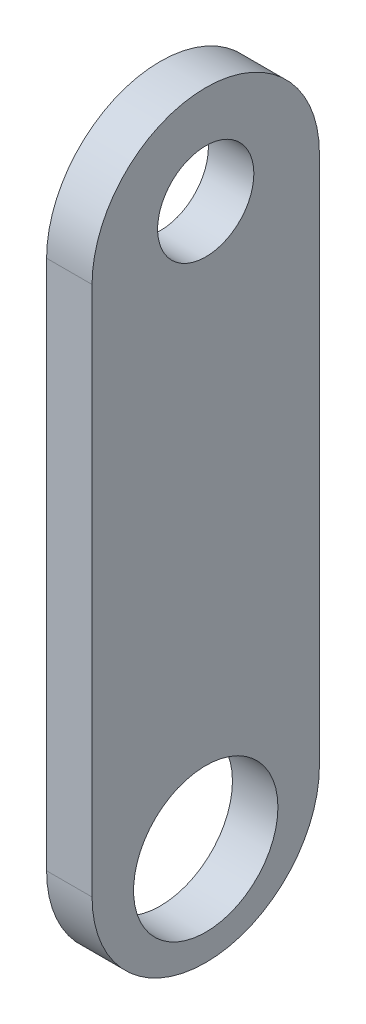
ISO-10303-21;
HEADER;
FILE_DESCRIPTION(('STEP AP214'),'2;1');
FILE_NAME('part.step','',(''),(''),'','','');
FILE_SCHEMA(('AUTOMOTIVE_DESIGN { 1 0 10303 214 1 1 1 1 }'));
ENDSEC;
DATA;
#1=APPLICATION_CONTEXT('core data for automotive mechanical design processes');
#2=APPLICATION_PROTOCOL_DEFINITION('international standard','automotive_design',2000,#1);
#3=PRODUCT_CONTEXT('',#1,'mechanical');
#4=PRODUCT('Part','Part','',(#3));
#5=PRODUCT_RELATED_PRODUCT_CATEGORY('part','',(#4));
#6=PRODUCT_DEFINITION_FORMATION('','',#4);
#7=PRODUCT_DEFINITION_CONTEXT('part definition',#1,'design');
#8=PRODUCT_DEFINITION('design','',#6,#7);
#9=PRODUCT_DEFINITION_SHAPE('','',#8);
#10=(LENGTH_UNIT() NAMED_UNIT(*) SI_UNIT(.MILLI.,.METRE.));
#11=(NAMED_UNIT(*) PLANE_ANGLE_UNIT() SI_UNIT($,.RADIAN.));
#12=(NAMED_UNIT(*) SI_UNIT($,.STERADIAN.) SOLID_ANGLE_UNIT());
#13=UNCERTAINTY_MEASURE_WITH_UNIT(LENGTH_MEASURE(1.E-05),#10,'distance_accuracy_value','');
#14=(GEOMETRIC_REPRESENTATION_CONTEXT(3) GLOBAL_UNCERTAINTY_ASSIGNED_CONTEXT((#13)) GLOBAL_UNIT_ASSIGNED_CONTEXT((#10,
#11,#12)) REPRESENTATION_CONTEXT('',''));
#15=CARTESIAN_POINT('',(0.,0.,0.));
#16=DIRECTION('',(0.,0.,1.));
#17=DIRECTION('',(1.,0.,0.));
#18=AXIS2_PLACEMENT_3D('',#15,#16,#17);
#19=CARTESIAN_POINT('',(3.,-17.5,0.));
#20=DIRECTION('',(-1.,0.,0.));
#21=DIRECTION('',(0.,0.,1.));
#22=AXIS2_PLACEMENT_3D('',#19,#20,#21);
#23=CYLINDRICAL_SURFACE('',#22,7.5);
#24=DIRECTION('',(-1.,0.,0.));
#25=VECTOR('',#24,1.);
#26=CARTESIAN_POINT('',(3.,-17.5,-7.5));
#27=LINE('',#26,#25);
#28=CARTESIAN_POINT('',(3.,-17.5,-7.5));
#29=VERTEX_POINT('',#28);
#30=CARTESIAN_POINT('',(0.,-17.5,-7.5));
#31=VERTEX_POINT('',#30);
#32=EDGE_CURVE('E98',#29,#31,#27,.T.);
#33=ORIENTED_EDGE('',*,*,#32,.F.);
#34=CARTESIAN_POINT('',(3.,-17.5,0.));
#35=DIRECTION('',(-1.,0.,0.));
#36=DIRECTION('',(0.,0.,1.));
#37=AXIS2_PLACEMENT_3D('',#34,#35,#36);
#38=CIRCLE('',#37,7.5);
#39=CARTESIAN_POINT('',(3.,-17.5,7.5));
#40=VERTEX_POINT('',#39);
#41=EDGE_CURVE('E50',#40,#29,#38,.F.);
#42=ORIENTED_EDGE('',*,*,#41,.F.);
#43=DIRECTION('',(1.,0.,0.));
#44=VECTOR('',#43,1.);
#45=CARTESIAN_POINT('',(3.,-17.5,7.5));
#46=LINE('',#45,#44);
#47=CARTESIAN_POINT('',(0.,-17.5,7.5));
#48=VERTEX_POINT('',#47);
#49=EDGE_CURVE('E120',#48,#40,#46,.T.);
#50=ORIENTED_EDGE('',*,*,#49,.F.);
#51=CARTESIAN_POINT('',(0.,-17.5,0.));
#52=DIRECTION('',(-1.,0.,0.));
#53=DIRECTION('',(0.,0.,1.));
#54=AXIS2_PLACEMENT_3D('',#51,#52,#53);
#55=CIRCLE('',#54,7.5);
#56=EDGE_CURVE('E11',#31,#48,#55,.T.);
#57=ORIENTED_EDGE('',*,*,#56,.F.);
#58=EDGE_LOOP('',(#33,#42,#50,#57));
#59=FACE_BOUND('',#58,.T.);
#60=ADVANCED_FACE('F41',(#59),#23,.T.);
#61=CARTESIAN_POINT('',(3.,17.5,0.));
#62=DIRECTION('',(-1.,0.,0.));
#63=DIRECTION('',(0.,0.,1.));
#64=AXIS2_PLACEMENT_3D('',#61,#62,#63);
#65=CYLINDRICAL_SURFACE('',#64,7.5);
#66=DIRECTION('',(-1.,0.,0.));
#67=VECTOR('',#66,1.);
#68=CARTESIAN_POINT('',(3.,17.5,7.5));
#69=LINE('',#68,#67);
#70=CARTESIAN_POINT('',(3.,17.5,7.5));
#71=VERTEX_POINT('',#70);
#72=CARTESIAN_POINT('',(0.,17.5,7.5));
#73=VERTEX_POINT('',#72);
#74=EDGE_CURVE('E94',#71,#73,#69,.T.);
#75=ORIENTED_EDGE('',*,*,#74,.F.);
#76=CARTESIAN_POINT('',(3.,17.5,0.));
#77=DIRECTION('',(-1.,0.,0.));
#78=DIRECTION('',(0.,0.,1.));
#79=AXIS2_PLACEMENT_3D('',#76,#77,#78);
#80=CIRCLE('',#79,7.5);
#81=CARTESIAN_POINT('',(3.,17.5,-7.5));
#82=VERTEX_POINT('',#81);
#83=EDGE_CURVE('E99',#82,#71,#80,.F.);
#84=ORIENTED_EDGE('',*,*,#83,.F.);
#85=DIRECTION('',(1.,0.,0.));
#86=VECTOR('',#85,1.);
#87=CARTESIAN_POINT('',(3.,17.5,-7.5));
#88=LINE('',#87,#86);
#89=CARTESIAN_POINT('',(0.,17.5,-7.5));
#90=VERTEX_POINT('',#89);
#91=EDGE_CURVE('E96',#90,#82,#88,.T.);
#92=ORIENTED_EDGE('',*,*,#91,.F.);
#93=CARTESIAN_POINT('',(0.,17.5,0.));
#94=DIRECTION('',(-1.,0.,0.));
#95=DIRECTION('',(0.,0.,1.));
#96=AXIS2_PLACEMENT_3D('',#93,#94,#95);
#97=CIRCLE('',#96,7.5);
#98=EDGE_CURVE('E82',#73,#90,#97,.T.);
#99=ORIENTED_EDGE('',*,*,#98,.F.);
#100=EDGE_LOOP('',(#75,#84,#92,#99));
#101=FACE_BOUND('',#100,.T.);
#102=ADVANCED_FACE('F92',(#101),#65,.T.);
#103=CARTESIAN_POINT('',(3.,-25.,7.5));
#104=DIRECTION('',(0.,0.,1.));
#105=DIRECTION('',(1.,0.,0.));
#106=AXIS2_PLACEMENT_3D('',#103,#104,#105);
#107=PLANE('',#106);
#108=DIRECTION('',(0.,1.,0.));
#109=VECTOR('',#108,1.);
#110=CARTESIAN_POINT('',(0.,-25.,7.5));
#111=LINE('',#110,#109);
#112=EDGE_CURVE('E79',#48,#73,#111,.T.);
#113=ORIENTED_EDGE('',*,*,#112,.F.);
#114=ORIENTED_EDGE('',*,*,#49,.T.);
#115=DIRECTION('',(0.,1.,0.));
#116=VECTOR('',#115,1.);
#117=CARTESIAN_POINT('',(3.,-25.,7.5));
#118=LINE('',#117,#116);
#119=EDGE_CURVE('E103',#40,#71,#118,.T.);
#120=ORIENTED_EDGE('',*,*,#119,.T.);
#121=ORIENTED_EDGE('',*,*,#74,.T.);
#122=EDGE_LOOP('',(#113,#114,#120,#121));
#123=FACE_BOUND('',#122,.T.);
#124=ADVANCED_FACE('F101',(#123),#107,.T.);
#125=CARTESIAN_POINT('',(3.,-25.,-7.5));
#126=DIRECTION('',(0.,0.,1.));
#127=DIRECTION('',(1.,0.,0.));
#128=AXIS2_PLACEMENT_3D('',#125,#126,#127);
#129=PLANE('',#128);
#130=DIRECTION('',(0.,1.,0.));
#131=VECTOR('',#130,1.);
#132=CARTESIAN_POINT('',(3.,-25.,-7.5));
#133=LINE('',#132,#131);
#134=EDGE_CURVE('E106',#29,#82,#133,.T.);
#135=ORIENTED_EDGE('',*,*,#134,.F.);
#136=ORIENTED_EDGE('',*,*,#32,.T.);
#137=DIRECTION('',(0.,1.,0.));
#138=VECTOR('',#137,1.);
#139=CARTESIAN_POINT('',(0.,-25.,-7.5));
#140=LINE('',#139,#138);
#141=EDGE_CURVE('E87',#31,#90,#140,.T.);
#142=ORIENTED_EDGE('',*,*,#141,.T.);
#143=ORIENTED_EDGE('',*,*,#91,.T.);
#144=EDGE_LOOP('',(#135,#136,#142,#143));
#145=FACE_BOUND('',#144,.T.);
#146=ADVANCED_FACE('F127',(#145),#129,.F.);
#147=CARTESIAN_POINT('',(3.,0.,0.));
#148=DIRECTION('',(-1.,0.,0.));
#149=DIRECTION('',(0.,0.,1.));
#150=AXIS2_PLACEMENT_3D('',#147,#148,#149);
#151=PLANE('',#150);
#152=CARTESIAN_POINT('',(3.,18.5,0.));
#153=DIRECTION('',(1.,0.,0.));
#154=DIRECTION('',(0.,0.,-1.));
#155=AXIS2_PLACEMENT_3D('',#152,#153,#154);
#156=CIRCLE('',#155,3.175);
#157=CARTESIAN_POINT('',(3.,18.5,-3.175));
#158=VERTEX_POINT('',#157);
#159=EDGE_CURVE('E135',#158,#158,#156,.T.);
#160=ORIENTED_EDGE('',*,*,#159,.F.);
#161=EDGE_LOOP('',(#160));
#162=FACE_BOUND('',#161,.T.);
#163=CARTESIAN_POINT('',(3.,-18.5,0.));
#164=DIRECTION('',(1.,0.,0.));
#165=DIRECTION('',(0.,0.,-1.));
#166=AXIS2_PLACEMENT_3D('',#163,#164,#165);
#167=CIRCLE('',#166,4.7625);
#168=CARTESIAN_POINT('',(3.,-18.5,-4.7625));
#169=VERTEX_POINT('',#168);
#170=EDGE_CURVE('E142',#169,#169,#167,.T.);
#171=ORIENTED_EDGE('',*,*,#170,.F.);
#172=EDGE_LOOP('',(#171));
#173=FACE_BOUND('',#172,.T.);
#174=ORIENTED_EDGE('',*,*,#119,.F.);
#175=ORIENTED_EDGE('',*,*,#41,.T.);
#176=ORIENTED_EDGE('',*,*,#134,.T.);
#177=ORIENTED_EDGE('',*,*,#83,.T.);
#178=EDGE_LOOP('',(#174,#175,#176,#177));
#179=FACE_BOUND('',#178,.T.);
#180=ADVANCED_FACE('F124',(#162,#173,#179),#151,.F.);
#181=CARTESIAN_POINT('',(0.,0.,0.));
#182=DIRECTION('',(-1.,0.,0.));
#183=DIRECTION('',(0.,0.,1.));
#184=AXIS2_PLACEMENT_3D('',#181,#182,#183);
#185=PLANE('',#184);
#186=CARTESIAN_POINT('',(0.,18.5,0.));
#187=DIRECTION('',(-1.,0.,0.));
#188=DIRECTION('',(0.,0.,1.));
#189=AXIS2_PLACEMENT_3D('',#186,#187,#188);
#190=CIRCLE('',#189,3.175);
#191=CARTESIAN_POINT('',(0.,18.5,3.175));
#192=VERTEX_POINT('',#191);
#193=EDGE_CURVE('E88',#192,#192,#190,.T.);
#194=ORIENTED_EDGE('',*,*,#193,.F.);
#195=EDGE_LOOP('',(#194));
#196=FACE_BOUND('',#195,.T.);
#197=CARTESIAN_POINT('',(0.,-18.5,0.));
#198=DIRECTION('',(-1.,0.,0.));
#199=DIRECTION('',(0.,0.,1.));
#200=AXIS2_PLACEMENT_3D('',#197,#198,#199);
#201=CIRCLE('',#200,4.7625);
#202=CARTESIAN_POINT('',(0.,-18.5,4.7625));
#203=VERTEX_POINT('',#202);
#204=EDGE_CURVE('E132',#203,#203,#201,.T.);
#205=ORIENTED_EDGE('',*,*,#204,.F.);
#206=EDGE_LOOP('',(#205));
#207=FACE_BOUND('',#206,.T.);
#208=ORIENTED_EDGE('',*,*,#141,.F.);
#209=ORIENTED_EDGE('',*,*,#56,.T.);
#210=ORIENTED_EDGE('',*,*,#112,.T.);
#211=ORIENTED_EDGE('',*,*,#98,.T.);
#212=EDGE_LOOP('',(#208,#209,#210,#211));
#213=FACE_BOUND('',#212,.T.);
#214=ADVANCED_FACE('F81',(#196,#207,#213),#185,.T.);
#215=CARTESIAN_POINT('',(-2.,-18.5,0.));
#216=DIRECTION('',(1.,0.,0.));
#217=DIRECTION('',(0.,0.,-1.));
#218=AXIS2_PLACEMENT_3D('',#215,#216,#217);
#219=CYLINDRICAL_SURFACE('',#218,4.7625);
#220=ORIENTED_EDGE('',*,*,#204,.T.);
#221=EDGE_LOOP('',(#220));
#222=FACE_BOUND('',#221,.T.);
#223=ORIENTED_EDGE('',*,*,#170,.T.);
#224=EDGE_LOOP('',(#223));
#225=FACE_BOUND('',#224,.T.);
#226=ADVANCED_FACE('F151',(#222,#225),#219,.F.);
#227=CARTESIAN_POINT('',(-2.,18.5,0.));
#228=DIRECTION('',(1.,0.,0.));
#229=DIRECTION('',(0.,0.,-1.));
#230=AXIS2_PLACEMENT_3D('',#227,#228,#229);
#231=CYLINDRICAL_SURFACE('',#230,3.175);
#232=ORIENTED_EDGE('',*,*,#193,.T.);
#233=EDGE_LOOP('',(#232));
#234=FACE_BOUND('',#233,.T.);
#235=ORIENTED_EDGE('',*,*,#159,.T.);
#236=EDGE_LOOP('',(#235));
#237=FACE_BOUND('',#236,.T.);
#238=ADVANCED_FACE('F202',(#234,#237),#231,.F.);
#239=CLOSED_SHELL('',(#60,#102,#124,#146,#180,#214,#226,#238));
#240=MANIFOLD_SOLID_BREP('B2',#239);
#241=ADVANCED_BREP_SHAPE_REPRESENTATION('',(#18,#240),#14);
#242=SHAPE_DEFINITION_REPRESENTATION(#9,#241);
ENDSEC;
END-ISO-10303-21;
